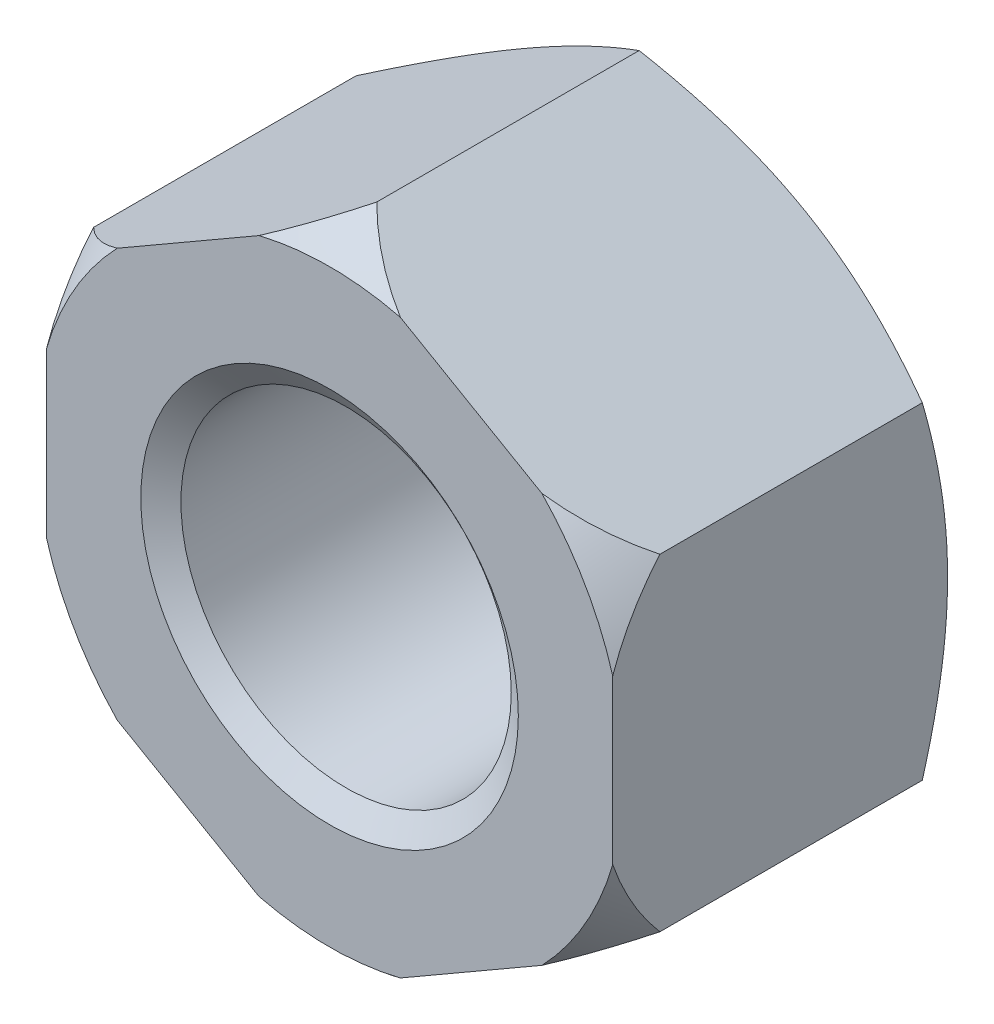
ISO-10303-21;
HEADER;
FILE_DESCRIPTION(('STEP AP214'),'2;1');
FILE_NAME('part.step','',(''),(''),'','','');
FILE_SCHEMA(('AUTOMOTIVE_DESIGN { 1 0 10303 214 1 1 1 1 }'));
ENDSEC;
DATA;
#1=APPLICATION_CONTEXT('core data for automotive mechanical design processes');
#2=APPLICATION_PROTOCOL_DEFINITION('international standard','automotive_design',2000,#1);
#3=PRODUCT_CONTEXT('',#1,'mechanical');
#4=PRODUCT('Part','Part','',(#3));
#5=PRODUCT_RELATED_PRODUCT_CATEGORY('part','',(#4));
#6=PRODUCT_DEFINITION_FORMATION('','',#4);
#7=PRODUCT_DEFINITION_CONTEXT('part definition',#1,'design');
#8=PRODUCT_DEFINITION('design','',#6,#7);
#9=PRODUCT_DEFINITION_SHAPE('','',#8);
#10=(LENGTH_UNIT() NAMED_UNIT(*) SI_UNIT(.MILLI.,.METRE.));
#11=(NAMED_UNIT(*) PLANE_ANGLE_UNIT() SI_UNIT($,.RADIAN.));
#12=(NAMED_UNIT(*) SI_UNIT($,.STERADIAN.) SOLID_ANGLE_UNIT());
#13=UNCERTAINTY_MEASURE_WITH_UNIT(LENGTH_MEASURE(1.E-05),#10,'distance_accuracy_value','');
#14=(GEOMETRIC_REPRESENTATION_CONTEXT(3) GLOBAL_UNCERTAINTY_ASSIGNED_CONTEXT((#13)) GLOBAL_UNIT_ASSIGNED_CONTEXT((#10,
#11,#12)) REPRESENTATION_CONTEXT('',''));
#15=CARTESIAN_POINT('',(0.,0.,0.));
#16=DIRECTION('',(0.,0.,1.));
#17=DIRECTION('',(1.,0.,0.));
#18=AXIS2_PLACEMENT_3D('',#15,#16,#17);
#19=CARTESIAN_POINT('',(0.,0.,-22.5298));
#20=DIRECTION('',(0.,0.,1.));
#21=DIRECTION('',(1.,0.,0.));
#22=AXIS2_PLACEMENT_3D('',#19,#20,#21);
#23=CYLINDRICAL_SURFACE('',#22,11.1125);
#24=CARTESIAN_POINT('',(0.,0.,-1.11157946690792));
#25=DIRECTION('',(0.,0.,1.));
#26=DIRECTION('',(1.,0.,0.));
#27=AXIS2_PLACEMENT_3D('',#24,#25,#26);
#28=CIRCLE('',#27,11.1125);
#29=CARTESIAN_POINT('',(11.1125,0.,-1.11157946690792));
#30=VERTEX_POINT('',#29);
#31=EDGE_CURVE('E149',#30,#30,#28,.F.);
#32=ORIENTED_EDGE('',*,*,#31,.F.);
#33=EDGE_LOOP('',(#32));
#34=FACE_BOUND('',#33,.T.);
#35=CARTESIAN_POINT('',(0.,0.,-21.3928205330921));
#36=DIRECTION('',(0.,0.,-1.));
#37=DIRECTION('',(-1.,0.,0.));
#38=AXIS2_PLACEMENT_3D('',#35,#36,#37);
#39=CIRCLE('',#38,11.1125);
#40=CARTESIAN_POINT('',(-11.1125,0.,-21.3928205330921));
#41=VERTEX_POINT('',#40);
#42=EDGE_CURVE('E37',#41,#41,#39,.F.);
#43=ORIENTED_EDGE('',*,*,#42,.F.);
#44=EDGE_LOOP('',(#43));
#45=FACE_BOUND('',#44,.T.);
#46=ADVANCED_FACE('F32',(#34,#45),#23,.F.);
#47=CARTESIAN_POINT('',(0.,21.9970452561248,0.));
#48=DIRECTION('',(0.,0.,-1.));
#49=DIRECTION('',(-1.,0.,0.));
#50=AXIS2_PLACEMENT_3D('',#47,#48,#49);
#51=PLANE('',#50);
#52=CARTESIAN_POINT('',(0.,0.,0.));
#53=DIRECTION('',(0.,0.,1.));
#54=DIRECTION('',(1.,0.,0.));
#55=AXIS2_PLACEMENT_3D('',#52,#53,#54);
#56=CIRCLE('',#55,12.7);
#57=CARTESIAN_POINT('',(12.7,0.,0.));
#58=VERTEX_POINT('',#57);
#59=EDGE_CURVE('E196',#58,#58,#56,.T.);
#60=ORIENTED_EDGE('',*,*,#59,.F.);
#61=EDGE_LOOP('',(#60));
#62=FACE_BOUND('',#61,.T.);
#63=DIRECTION('',(0.,-1.,0.));
#64=VECTOR('',#63,1.);
#65=CARTESIAN_POINT('',(-19.05,10.9985226280624,0.));
#66=LINE('',#65,#64);
#67=CARTESIAN_POINT('',(-19.05,5.49926131403105,0.));
#68=VERTEX_POINT('',#67);
#69=CARTESIAN_POINT('',(-19.05,-5.49926131403105,0.));
#70=VERTEX_POINT('',#69);
#71=EDGE_CURVE('E360',#68,#70,#66,.T.);
#72=ORIENTED_EDGE('',*,*,#71,.T.);
#73=CARTESIAN_POINT('',(0.,0.,0.));
#74=DIRECTION('',(0.,0.,-1.));
#75=DIRECTION('',(-1.,0.,0.));
#76=AXIS2_PLACEMENT_3D('',#73,#74,#75);
#77=CIRCLE('',#76,19.8278686449149);
#78=CARTESIAN_POINT('',(-14.2874999999999,-13.7481532850781,0.));
#79=VERTEX_POINT('',#78);
#80=EDGE_CURVE('E11',#70,#79,#77,.F.);
#81=ORIENTED_EDGE('',*,*,#80,.T.);
#82=DIRECTION('',(0.866025403784438,-0.5,0.));
#83=VECTOR('',#82,1.);
#84=CARTESIAN_POINT('',(-19.05,-10.9985226280624,0.));
#85=LINE('',#84,#83);
#86=CARTESIAN_POINT('',(-4.76250000000018,-19.2474145991091,0.));
#87=VERTEX_POINT('',#86);
#88=EDGE_CURVE('E169',#79,#87,#85,.T.);
#89=ORIENTED_EDGE('',*,*,#88,.T.);
#90=CARTESIAN_POINT('',(4.76250000000019,-19.2474145991091,0.));
#91=VERTEX_POINT('',#90);
#92=EDGE_CURVE('E42',#87,#91,#77,.F.);
#93=ORIENTED_EDGE('',*,*,#92,.T.);
#94=DIRECTION('',(0.866025403784439,0.5,0.));
#95=VECTOR('',#94,1.);
#96=CARTESIAN_POINT('',(0.,-21.9970452561248,0.));
#97=LINE('',#96,#95);
#98=CARTESIAN_POINT('',(14.2874999999998,-13.7481532850781,0.));
#99=VERTEX_POINT('',#98);
#100=EDGE_CURVE('E165',#91,#99,#97,.T.);
#101=ORIENTED_EDGE('',*,*,#100,.T.);
#102=CARTESIAN_POINT('',(19.05,-5.49926131403103,0.));
#103=VERTEX_POINT('',#102);
#104=EDGE_CURVE('E163',#99,#103,#77,.F.);
#105=ORIENTED_EDGE('',*,*,#104,.T.);
#106=DIRECTION('',(0.,-1.,0.));
#107=VECTOR('',#106,1.);
#108=CARTESIAN_POINT('',(19.05,10.9985226280624,0.));
#109=LINE('',#108,#107);
#110=CARTESIAN_POINT('',(19.05,5.49926131403103,0.));
#111=VERTEX_POINT('',#110);
#112=EDGE_CURVE('E155',#111,#103,#109,.T.);
#113=ORIENTED_EDGE('',*,*,#112,.F.);
#114=CARTESIAN_POINT('',(0.,0.,0.));
#115=DIRECTION('',(0.,0.,1.));
#116=DIRECTION('',(1.,0.,0.));
#117=AXIS2_PLACEMENT_3D('',#114,#115,#116);
#118=CIRCLE('',#117,19.8278686449149);
#119=CARTESIAN_POINT('',(14.2874999999999,13.748153285078,0.));
#120=VERTEX_POINT('',#119);
#121=EDGE_CURVE('E140',#111,#120,#118,.T.);
#122=ORIENTED_EDGE('',*,*,#121,.T.);
#123=DIRECTION('',(-0.866025403784438,0.500000000000001,0.));
#124=VECTOR('',#123,1.);
#125=CARTESIAN_POINT('',(19.05,10.9985226280624,0.));
#126=LINE('',#125,#124);
#127=CARTESIAN_POINT('',(4.76250000000015,19.2474145991091,0.));
#128=VERTEX_POINT('',#127);
#129=EDGE_CURVE('E164',#120,#128,#126,.T.);
#130=ORIENTED_EDGE('',*,*,#129,.T.);
#131=CARTESIAN_POINT('',(-4.76250000000013,19.2474145991091,0.));
#132=VERTEX_POINT('',#131);
#133=EDGE_CURVE('E194',#128,#132,#77,.F.);
#134=ORIENTED_EDGE('',*,*,#133,.T.);
#135=DIRECTION('',(-0.866025403784438,-0.5,0.));
#136=VECTOR('',#135,1.);
#137=CARTESIAN_POINT('',(0.,21.9970452561248,0.));
#138=LINE('',#137,#136);
#139=CARTESIAN_POINT('',(-14.2874999999999,13.748153285078,0.));
#140=VERTEX_POINT('',#139);
#141=EDGE_CURVE('E284',#132,#140,#138,.T.);
#142=ORIENTED_EDGE('',*,*,#141,.T.);
#143=EDGE_CURVE('E44',#140,#68,#77,.F.);
#144=ORIENTED_EDGE('',*,*,#143,.T.);
#145=EDGE_LOOP('',(#72,#81,#89,#93,#101,#105,#113,#122,#130,#134,#142,#144));
#146=FACE_BOUND('',#145,.T.);
#147=ADVANCED_FACE('F161',(#62,#146),#51,.F.);
#148=CARTESIAN_POINT('',(0.,21.9970452561248,-22.5298));
#149=DIRECTION('',(0.,0.,-1.));
#150=DIRECTION('',(-1.,0.,0.));
#151=AXIS2_PLACEMENT_3D('',#148,#149,#150);
#152=PLANE('',#151);
#153=CARTESIAN_POINT('',(0.,0.,-22.5298));
#154=DIRECTION('',(0.,0.,-1.));
#155=DIRECTION('',(-1.,0.,0.));
#156=AXIS2_PLACEMENT_3D('',#153,#154,#155);
#157=CIRCLE('',#156,12.7);
#158=CARTESIAN_POINT('',(-12.7,0.,-22.5298));
#159=VERTEX_POINT('',#158);
#160=EDGE_CURVE('E197',#159,#159,#157,.F.);
#161=ORIENTED_EDGE('',*,*,#160,.T.);
#162=EDGE_LOOP('',(#161));
#163=FACE_BOUND('',#162,.T.);
#164=CARTESIAN_POINT('',(0.,0.,-22.5298));
#165=DIRECTION('',(0.,0.,-1.));
#166=DIRECTION('',(-1.,0.,0.));
#167=AXIS2_PLACEMENT_3D('',#164,#165,#166);
#168=CIRCLE('',#167,19.05);
#169=CARTESIAN_POINT('',(-19.05,0.,-22.5298));
#170=VERTEX_POINT('',#169);
#171=CARTESIAN_POINT('',(-9.52500000000001,-16.4977839420936,-22.5298));
#172=VERTEX_POINT('',#171);
#173=EDGE_CURVE('E191',#170,#172,#168,.F.);
#174=ORIENTED_EDGE('',*,*,#173,.F.);
#175=CARTESIAN_POINT('',(-9.52500000000001,16.4977839420936,-22.5298));
#176=VERTEX_POINT('',#175);
#177=EDGE_CURVE('E176',#176,#170,#168,.F.);
#178=ORIENTED_EDGE('',*,*,#177,.F.);
#179=CARTESIAN_POINT('',(9.52500000000002,16.4977839420936,-22.5298));
#180=VERTEX_POINT('',#179);
#181=EDGE_CURVE('E190',#180,#176,#168,.F.);
#182=ORIENTED_EDGE('',*,*,#181,.F.);
#183=CARTESIAN_POINT('',(0.,0.,-22.5298));
#184=DIRECTION('',(0.,0.,1.));
#185=DIRECTION('',(1.,0.,0.));
#186=AXIS2_PLACEMENT_3D('',#183,#184,#185);
#187=CIRCLE('',#186,19.05);
#188=CARTESIAN_POINT('',(19.05,0.,-22.5298));
#189=VERTEX_POINT('',#188);
#190=EDGE_CURVE('E223',#189,#180,#187,.T.);
#191=ORIENTED_EDGE('',*,*,#190,.F.);
#192=CARTESIAN_POINT('',(9.525,-16.4977839420936,-22.5298));
#193=VERTEX_POINT('',#192);
#194=EDGE_CURVE('E378',#193,#189,#168,.F.);
#195=ORIENTED_EDGE('',*,*,#194,.F.);
#196=EDGE_CURVE('E376',#172,#193,#168,.F.);
#197=ORIENTED_EDGE('',*,*,#196,.F.);
#198=EDGE_LOOP('',(#174,#178,#182,#191,#195,#197));
#199=FACE_BOUND('',#198,.T.);
#200=ADVANCED_FACE('F312',(#163,#199),#152,.T.);
#201=CARTESIAN_POINT('',(0.,21.9970452561248,-22.5298));
#202=DIRECTION('',(-0.5,0.866025403784438,0.));
#203=DIRECTION('',(-0.866025403784439,-0.5,0.));
#204=AXIS2_PLACEMENT_3D('',#201,#202,#203);
#205=PLANE('',#204);
#206=CARTESIAN_POINT('',(-9.52500000000001,16.4977839420936,-15.875));
#207=DIRECTION('',(-0.5,0.866025403784438,0.));
#208=DIRECTION('',(-0.866025403784439,-0.5,0.));
#209=AXIS2_PLACEMENT_3D('',#206,#207,#208);
#210=CIRCLE('',#209,16.8005208252601);
#211=CARTESIAN_POINT('',(0.,21.9970452561248,-3.17500000000008));
#212=VERTEX_POINT('',#211);
#213=EDGE_CURVE('E214',#212,#132,#210,.F.);
#214=ORIENTED_EDGE('',*,*,#213,.F.);
#215=DIRECTION('',(0.,0.,1.));
#216=VECTOR('',#215,1.);
#217=CARTESIAN_POINT('',(0.,21.9970452561248,-22.5298));
#218=LINE('',#217,#216);
#219=CARTESIAN_POINT('',(0.,21.9970452561248,-20.8283226280624));
#220=VERTEX_POINT('',#219);
#221=EDGE_CURVE('E173',#220,#212,#218,.T.);
#222=ORIENTED_EDGE('',*,*,#221,.F.);
#223=CARTESIAN_POINT('',(-19.0502,10.9984071580085,-20.8282559608708));
#224=CARTESIAN_POINT('',(-18.6314889424188,11.2401500998157,-20.9678165828918));
#225=CARTESIAN_POINT('',(-18.2111446870423,11.4828359688097,-21.1010441544707));
#226=CARTESIAN_POINT('',(-17.3670855155916,11.9701537586587,-21.3530728349218));
#227=CARTESIAN_POINT('',(-16.9433695394589,12.2147862915388,-21.4718691989687));
#228=CARTESIAN_POINT('',(-16.0917480208183,12.7064702045736,-21.6934385965292));
#229=CARTESIAN_POINT('',(-15.6638350258304,12.9535258874197,-21.7961737172867));
#230=CARTESIAN_POINT('',(-14.8050356703556,13.4493539264829,-21.9834145659122));
#231=CARTESIAN_POINT('',(-14.374149481613,13.6981261835436,-22.0679213377796));
#232=CARTESIAN_POINT('',(-13.5204444881885,14.1910129913057,-22.2151111722824));
#233=CARTESIAN_POINT('',(-13.0976890621094,14.4350909503539,-22.2782814079947));
#234=CARTESIAN_POINT('',(-12.250241089937,14.9243652652118,-22.3842036549849));
#235=CARTESIAN_POINT('',(-11.8255485067156,15.1695616424575,-22.4269552732395));
#236=CARTESIAN_POINT('',(-10.9754499399404,15.6603662788229,-22.4909608321001));
#237=CARTESIAN_POINT('',(-10.5500454086646,15.9059736994695,-22.5122403182784));
#238=CARTESIAN_POINT('',(-9.69884369005559,16.397415240843,-22.532843984881));
#239=CARTESIAN_POINT('',(-9.27304651526212,16.6432493543302,-22.5321688437294));
#240=CARTESIAN_POINT('',(-8.47700964232624,17.1028414572046,-22.5103966011497));
#241=CARTESIAN_POINT('',(-8.10671322507251,17.316632193386,-22.4919544300647));
#242=CARTESIAN_POINT('',(-7.3670036910329,17.7437036919859,-22.4388155695897));
#243=CARTESIAN_POINT('',(-6.99759056167258,17.9569844616643,-22.404119112996));
#244=CARTESIAN_POINT('',(-6.25978756382387,18.3829552210812,-22.3190737251097));
#245=CARTESIAN_POINT('',(-5.89139892582436,18.5956445003966,-22.2687106394333));
#246=CARTESIAN_POINT('',(-5.1563753345796,19.0200105686625,-22.1532206991707));
#247=CARTESIAN_POINT('',(-4.7897403739103,19.2316873618992,-22.0880939071419));
#248=CARTESIAN_POINT('',(-3.67677271593589,19.8742595388301,-21.8689116004567));
#249=CARTESIAN_POINT('',(-2.93366305060603,20.3032941041457,-21.6930008306796));
#250=CARTESIAN_POINT('',(-1.45852420538159,21.1549659135281,-21.2937556590568));
#251=CARTESIAN_POINT('',(-0.726476139694536,21.5776140613123,-21.0705150174847));
#252=CARTESIAN_POINT('',(0.000200000000004846,21.9971607261786,-20.8282559608708));
#253=B_SPLINE_CURVE_WITH_KNOTS('',3,(#223,#224,#225,#226,#227,#228,#229,#230,#231,#232,#233,
#234,#235,#236,#237,#238,#239,#240,#241,#242,#243,#244,#245,#246,#247,#248,#249,#250,#251,#252),
.UNSPECIFIED.,.F.,.F.,(4,2,2,2,2,2,2,2,2,2,2,2,2,2,4),(0.,1.50971559281794,3.01992622800797,
4.53364959201314,6.04728623691164,7.52356313869614,8.99986845512144,10.4744153207586,
11.9489166211862,13.2325441548787,14.5161533048254,15.8009255464228,17.085692344219,
19.7118183650732,22.3327898553892),.UNSPECIFIED.);
#254=EDGE_CURVE('E276',#176,#220,#253,.T.);
#255=ORIENTED_EDGE('',*,*,#254,.F.);
#256=CARTESIAN_POINT('',(-19.05,10.9985226280624,-20.8283226280624));
#257=VERTEX_POINT('',#256);
#258=EDGE_CURVE('E270',#257,#176,#253,.T.);
#259=ORIENTED_EDGE('',*,*,#258,.F.);
#260=DIRECTION('',(0.,0.,1.));
#261=VECTOR('',#260,1.);
#262=CARTESIAN_POINT('',(-19.05,10.9985226280624,-22.5298));
#263=LINE('',#262,#261);
#264=CARTESIAN_POINT('',(-19.05,10.9985226280624,-3.17500000000008));
#265=VERTEX_POINT('',#264);
#266=EDGE_CURVE('E167',#257,#265,#263,.T.);
#267=ORIENTED_EDGE('',*,*,#266,.T.);
#268=EDGE_CURVE('E211',#140,#265,#210,.F.);
#269=ORIENTED_EDGE('',*,*,#268,.F.);
#270=ORIENTED_EDGE('',*,*,#141,.F.);
#271=EDGE_LOOP('',(#214,#222,#255,#259,#267,#269,#270));
#272=FACE_BOUND('',#271,.T.);
#273=ADVANCED_FACE('F34',(#272),#205,.T.);
#274=CARTESIAN_POINT('',(19.05,10.9985226280624,-22.5298));
#275=DIRECTION('',(0.500000000000001,0.866025403784438,0.));
#276=DIRECTION('',(-0.866025403784438,0.500000000000001,0.));
#277=AXIS2_PLACEMENT_3D('',#274,#275,#276);
#278=PLANE('',#277);
#279=CARTESIAN_POINT('',(9.52500000000002,16.4977839420936,-15.875));
#280=DIRECTION('',(0.500000000000001,0.866025403784438,0.));
#281=DIRECTION('',(-0.866025403784438,0.500000000000001,0.));
#282=AXIS2_PLACEMENT_3D('',#279,#280,#281);
#283=CIRCLE('',#282,16.8005208252601);
#284=CARTESIAN_POINT('',(19.05,10.9985226280624,-3.17500000000008));
#285=VERTEX_POINT('',#284);
#286=EDGE_CURVE('E51',#285,#120,#283,.F.);
#287=ORIENTED_EDGE('',*,*,#286,.F.);
#288=DIRECTION('',(0.,0.,1.));
#289=VECTOR('',#288,1.);
#290=CARTESIAN_POINT('',(19.05,10.9985226280624,-22.5298));
#291=LINE('',#290,#289);
#292=CARTESIAN_POINT('',(19.05,10.9985226280624,-20.8283226280624));
#293=VERTEX_POINT('',#292);
#294=EDGE_CURVE('E158',#293,#285,#291,.T.);
#295=ORIENTED_EDGE('',*,*,#294,.F.);
#296=CARTESIAN_POINT('',(-0.000199999999995582,21.9971607261786,-20.8282559608708));
#297=CARTESIAN_POINT('',(0.418511057581229,21.7554177843714,-20.9678165828918));
#298=CARTESIAN_POINT('',(0.838855312957746,21.5127319153775,-21.1010441544707));
#299=CARTESIAN_POINT('',(1.68291448440843,21.0254141255284,-21.3530728349218));
#300=CARTESIAN_POINT('',(2.10663046054108,20.7807815926483,-21.4718691989687));
#301=CARTESIAN_POINT('',(2.95825197918166,20.2890976796135,-21.6934385965292));
#302=CARTESIAN_POINT('',(3.38616497416957,20.0420419967675,-21.7961737172867));
#303=CARTESIAN_POINT('',(4.24496432964445,19.5462139577042,-21.9834145659122));
#304=CARTESIAN_POINT('',(4.67585051838703,19.2974417006435,-22.0679213377796));
#305=CARTESIAN_POINT('',(5.52955551181152,18.8045548928814,-22.2151111722824));
#306=CARTESIAN_POINT('',(5.95231093789063,18.5604769338332,-22.2782814079947));
#307=CARTESIAN_POINT('',(6.799758910063,18.0712026189753,-22.3842036549849));
#308=CARTESIAN_POINT('',(7.22445149328436,17.8260062417296,-22.4269552732395));
#309=CARTESIAN_POINT('',(8.07455006005965,17.3352016053642,-22.4909608321001));
#310=CARTESIAN_POINT('',(8.49995459133543,17.0895941847176,-22.5122403182784));
#311=CARTESIAN_POINT('',(9.35115630994441,16.5981526433441,-22.532843984881));
#312=CARTESIAN_POINT('',(9.77695348473788,16.3523185298569,-22.5321688437294));
#313=CARTESIAN_POINT('',(10.5729903576738,15.8927264269825,-22.5103966011497));
#314=CARTESIAN_POINT('',(10.9432867749275,15.6789356908011,-22.4919544300647));
#315=CARTESIAN_POINT('',(11.6829963089671,15.2518641922012,-22.4388155695897));
#316=CARTESIAN_POINT('',(12.0524094383274,15.0385834225228,-22.4041191129961));
#317=CARTESIAN_POINT('',(12.7902124361761,14.612612663106,-22.3190737251097));
#318=CARTESIAN_POINT('',(13.1586010741756,14.3999233837905,-22.2687106394333));
#319=CARTESIAN_POINT('',(13.8936246654204,13.9755573155246,-22.1532206991707));
#320=CARTESIAN_POINT('',(14.2602596260897,13.7638805222879,-22.0880939071419));
#321=CARTESIAN_POINT('',(15.3732272840641,13.121308345357,-21.8689116004567));
#322=CARTESIAN_POINT('',(16.116336949394,12.6922737800414,-21.6930008306796));
#323=CARTESIAN_POINT('',(17.5914757946184,11.840601970659,-21.2937556590568));
#324=CARTESIAN_POINT('',(18.3235238603055,11.4179538228748,-21.0705150174847));
#325=CARTESIAN_POINT('',(19.0502,10.9984071580085,-20.8282559608708));
#326=B_SPLINE_CURVE_WITH_KNOTS('',3,(#296,#297,#298,#299,#300,#301,#302,#303,#304,#305,#306,
#307,#308,#309,#310,#311,#312,#313,#314,#315,#316,#317,#318,#319,#320,#321,#322,#323,#324,#325),
.UNSPECIFIED.,.F.,.F.,(4,2,2,2,2,2,2,2,2,2,2,2,2,2,4),(0.,1.50971559281794,3.01992622800797,
4.53364959201314,6.04728623691165,7.52356313869614,8.99986845512144,10.4744153207586,
11.9489166211862,13.2325441548787,14.5161533048254,15.8009255464228,17.085692344219,
19.7118183650732,22.3327898553892),.UNSPECIFIED.);
#327=EDGE_CURVE('E277',#180,#293,#326,.T.);
#328=ORIENTED_EDGE('',*,*,#327,.F.);
#329=EDGE_CURVE('E283',#220,#180,#326,.T.);
#330=ORIENTED_EDGE('',*,*,#329,.F.);
#331=ORIENTED_EDGE('',*,*,#221,.T.);
#332=EDGE_CURVE('E222',#128,#212,#283,.F.);
#333=ORIENTED_EDGE('',*,*,#332,.F.);
#334=ORIENTED_EDGE('',*,*,#129,.F.);
#335=EDGE_LOOP('',(#287,#295,#328,#330,#331,#333,#334));
#336=FACE_BOUND('',#335,.T.);
#337=ADVANCED_FACE('F286',(#336),#278,.T.);
#338=CARTESIAN_POINT('',(19.05,10.9985226280624,-22.5298));
#339=DIRECTION('',(-1.,0.,0.));
#340=DIRECTION('',(0.,0.,1.));
#341=AXIS2_PLACEMENT_3D('',#338,#339,#340);
#342=PLANE('',#341);
#343=ORIENTED_EDGE('',*,*,#112,.T.);
#344=CARTESIAN_POINT('',(19.05,0.,-15.875));
#345=DIRECTION('',(-1.,0.,0.));
#346=DIRECTION('',(0.,0.,1.));
#347=AXIS2_PLACEMENT_3D('',#344,#345,#346);
#348=CIRCLE('',#347,16.8005208252601);
#349=CARTESIAN_POINT('',(19.05,-10.9985226280624,-3.17500000000008));
#350=VERTEX_POINT('',#349);
#351=EDGE_CURVE('E59',#103,#350,#348,.F.);
#352=ORIENTED_EDGE('',*,*,#351,.T.);
#353=DIRECTION('',(0.,0.,1.));
#354=VECTOR('',#353,1.);
#355=CARTESIAN_POINT('',(19.05,-10.9985226280624,-22.5298));
#356=LINE('',#355,#354);
#357=CARTESIAN_POINT('',(19.05,-10.9985226280624,-20.8283226280624));
#358=VERTEX_POINT('',#357);
#359=EDGE_CURVE('E178',#358,#350,#356,.T.);
#360=ORIENTED_EDGE('',*,*,#359,.F.);
#361=CARTESIAN_POINT('',(19.05,-29.169702852179,-13.4138662638416));
#362=CARTESIAN_POINT('',(19.05,-28.7515170158437,-13.6160110956725));
#363=CARTESIAN_POINT('',(19.05,-28.3328257173085,-13.8171097388201));
#364=CARTESIAN_POINT('',(19.05,-27.494325409167,-14.2169745091899));
#365=CARTESIAN_POINT('',(19.05,-27.0745163873414,-14.4157406107826));
#366=CARTESIAN_POINT('',(19.05,-25.813129635616,-15.0082374735336));
#367=CARTESIAN_POINT('',(19.05,-24.9697281338906,-15.3981009037459));
#368=CARTESIAN_POINT('',(19.05,-23.2722707252134,-16.1672287767744));
#369=CARTESIAN_POINT('',(19.05,-22.4181814672043,-16.546419798557));
#370=CARTESIAN_POINT('',(19.05,-20.7029839633497,-17.2885211662357));
#371=CARTESIAN_POINT('',(19.05,-19.8418760858487,-17.6514323600953));
#372=CARTESIAN_POINT('',(19.05,-18.1005821949281,-18.3609430110762));
#373=CARTESIAN_POINT('',(19.05,-17.2202917493445,-18.7072875110348));
#374=CARTESIAN_POINT('',(19.05,-15.4493217028707,-19.3728520719423));
#375=CARTESIAN_POINT('',(19.05,-14.5586409597487,-19.6920691181272));
#376=CARTESIAN_POINT('',(19.05,-12.7673320093036,-20.2947971916329));
#377=CARTESIAN_POINT('',(19.05,-11.8667295562314,-20.5783841335592));
#378=CARTESIAN_POINT('',(19.05,-10.0526343476905,-21.1006560776936));
#379=CARTESIAN_POINT('',(19.05,-9.13914576283874,-21.3393552650209));
#380=CARTESIAN_POINT('',(19.05,-7.75907469613669,-21.6550001353604));
#381=CARTESIAN_POINT('',(19.05,-7.29731333096125,-21.7531639276993));
#382=CARTESIAN_POINT('',(19.05,-6.37071732035876,-21.9338068057719));
#383=CARTESIAN_POINT('',(19.05,-5.90588274419356,-22.0162862437501));
#384=CARTESIAN_POINT('',(19.05,-4.97345228347655,-22.164098170237));
#385=CARTESIAN_POINT('',(19.05,-4.50585623113595,-22.2294296056319));
#386=CARTESIAN_POINT('',(19.05,-3.56843861997923,-22.3416333265324));
#387=CARTESIAN_POINT('',(19.05,-3.09861705851874,-22.388505590099));
#388=CARTESIAN_POINT('',(19.05,-2.16041609237781,-22.4625291100109));
#389=CARTESIAN_POINT('',(19.05,-1.6920464874522,-22.4898037599781));
#390=CARTESIAN_POINT('',(19.05,-0.754574655686925,-22.5244886648534));
#391=CARTESIAN_POINT('',(19.05,-0.285472440023931,-22.5318992199015));
#392=CARTESIAN_POINT('',(19.05,0.652492903955211,-22.5266801819297));
#393=CARTESIAN_POINT('',(19.05,1.1213560625119,-22.5140561325829));
#394=CARTESIAN_POINT('',(19.05,2.05813737693966,-22.4690817861607));
#395=CARTESIAN_POINT('',(19.05,2.52605549030136,-22.4367306207241));
#396=CARTESIAN_POINT('',(19.05,3.65980250445306,-22.3351199015635));
#397=CARTESIAN_POINT('',(19.05,4.32476458495627,-22.2559962800964));
#398=CARTESIAN_POINT('',(19.05,5.64947952989346,-22.0623146371856));
#399=CARTESIAN_POINT('',(19.05,6.30923160661033,-21.9477513588539));
#400=CARTESIAN_POINT('',(19.05,8.2818238219053,-21.556648180003));
#401=CARTESIAN_POINT('',(19.05,9.58542312013704,-21.2329552971933));
#402=CARTESIAN_POINT('',(19.05,11.5353898831337,-20.6748015455895));
#403=CARTESIAN_POINT('',(19.05,12.191945455476,-20.4739165985094));
#404=CARTESIAN_POINT('',(19.05,13.498713616712,-20.0521176359409));
#405=CARTESIAN_POINT('',(19.05,14.1489256271383,-19.8312018124068));
#406=CARTESIAN_POINT('',(19.05,15.439765608065,-19.3740482582399));
#407=CARTESIAN_POINT('',(19.05,16.0804269482461,-19.1379039599531));
#408=CARTESIAN_POINT('',(19.05,17.0373840365627,-18.7734634596579));
#409=CARTESIAN_POINT('',(19.05,17.3556458209396,-18.650300142409));
#410=CARTESIAN_POINT('',(19.05,17.9909330309769,-18.4008420821487));
#411=CARTESIAN_POINT('',(19.05,18.3079584810038,-18.2745474012171));
#412=CARTESIAN_POINT('',(19.05,18.6244086642405,-18.1468283563449));
#413=B_SPLINE_CURVE_WITH_KNOTS('',3,(#361,#362,#363,#364,#365,#366,#367,#368,#369,#370,#371,
#372,#373,#374,#375,#376,#377,#378,#379,#380,#381,#382,#383,#384,#385,#386,#387,#388,#389,#390,
#391,#392,#393,#394,#395,#396,#397,#398,#399,#400,#401,#402,#403,#404,#405,#406,#407,#408,#409,
#410,#411,#412),.UNSPECIFIED.,.F.,.F.,(4,2,2,2,2,2,2,2,2,2,2,2,2,2,2,2,2,2,2,2,2,2,2,2,2,4),(0.,
1.39343811466813,2.78689152584544,5.57425145066782,8.37756231436865,11.1807269927528,
14.0183059326613,16.856199810853,19.6879407755784,22.5187853636699,23.934802353684,
25.3507875385607,26.766859663288,28.1829334710278,29.5900111205978,30.9970675095625,
32.4037346270206,33.8104636685473,35.8182820070619,37.8263983152062,41.8503661996048,
43.910005496493,45.9698308879145,48.018040072954,49.0418117683235,50.0655631834717),.UNSPECIFIED.);
#414=EDGE_CURVE('E264',#358,#189,#413,.T.);
#415=ORIENTED_EDGE('',*,*,#414,.T.);
#416=EDGE_CURVE('E275',#189,#293,#413,.T.);
#417=ORIENTED_EDGE('',*,*,#416,.T.);
#418=ORIENTED_EDGE('',*,*,#294,.T.);
#419=EDGE_CURVE('E143',#285,#111,#348,.F.);
#420=ORIENTED_EDGE('',*,*,#419,.T.);
#421=EDGE_LOOP('',(#343,#352,#360,#415,#417,#418,#420));
#422=FACE_BOUND('',#421,.T.);
#423=ADVANCED_FACE('F154',(#422),#342,.F.);
#424=CARTESIAN_POINT('',(0.,-21.9970452561248,-22.5298));
#425=DIRECTION('',(0.5,-0.866025403784439,0.));
#426=DIRECTION('',(0.866025403784439,0.5,0.));
#427=AXIS2_PLACEMENT_3D('',#424,#425,#426);
#428=PLANE('',#427);
#429=CARTESIAN_POINT('',(9.52500000000001,-16.4977839420936,-15.875));
#430=DIRECTION('',(0.5,-0.866025403784439,0.));
#431=DIRECTION('',(0.866025403784439,0.5,0.));
#432=AXIS2_PLACEMENT_3D('',#429,#430,#431);
#433=CIRCLE('',#432,16.8005208252601);
#434=CARTESIAN_POINT('',(0.,-21.9970452561248,-3.17500000000008));
#435=VERTEX_POINT('',#434);
#436=EDGE_CURVE('E218',#435,#91,#433,.F.);
#437=ORIENTED_EDGE('',*,*,#436,.F.);
#438=DIRECTION('',(0.,0.,1.));
#439=VECTOR('',#438,1.);
#440=CARTESIAN_POINT('',(0.,-21.9970452561248,-22.5298));
#441=LINE('',#440,#439);
#442=CARTESIAN_POINT('',(0.,-21.9970452561248,-20.8283226280624));
#443=VERTEX_POINT('',#442);
#444=EDGE_CURVE('E181',#443,#435,#441,.T.);
#445=ORIENTED_EDGE('',*,*,#444,.F.);
#446=CARTESIAN_POINT('',(19.0502,-10.9984071580086,-20.8282559608708));
#447=CARTESIAN_POINT('',(18.6314889424188,-11.2401500998157,-20.9678165828918));
#448=CARTESIAN_POINT('',(18.2111446870423,-11.4828359688097,-21.1010441544707));
#449=CARTESIAN_POINT('',(17.3670855155916,-11.9701537586587,-21.3530728349218));
#450=CARTESIAN_POINT('',(16.9433695394589,-12.2147862915388,-21.4718691989687));
#451=CARTESIAN_POINT('',(16.0917480208183,-12.7064702045737,-21.6934385965292));
#452=CARTESIAN_POINT('',(15.6638350258304,-12.9535258874197,-21.7961737172867));
#453=CARTESIAN_POINT('',(14.8050356703556,-13.449353926483,-21.9834145659122));
#454=CARTESIAN_POINT('',(14.374149481613,-13.6981261835436,-22.0679213377796));
#455=CARTESIAN_POINT('',(13.5204444881885,-14.1910129913057,-22.2151111722823));
#456=CARTESIAN_POINT('',(13.0976890621094,-14.4350909503539,-22.2782814079947));
#457=CARTESIAN_POINT('',(12.250241089937,-14.9243652652118,-22.3842036549849));
#458=CARTESIAN_POINT('',(11.8255485067156,-15.1695616424575,-22.4269552732395));
#459=CARTESIAN_POINT('',(10.9754499399404,-15.6603662788229,-22.4909608321001));
#460=CARTESIAN_POINT('',(10.5500454086646,-15.9059736994695,-22.5122403182784));
#461=CARTESIAN_POINT('',(9.69884369005559,-16.3974152408431,-22.532843984881));
#462=CARTESIAN_POINT('',(9.27304651526212,-16.6432493543303,-22.5321688437294));
#463=CARTESIAN_POINT('',(8.47700964232623,-17.1028414572047,-22.5103966011497));
#464=CARTESIAN_POINT('',(8.10671322507251,-17.3166321933861,-22.4919544300647));
#465=CARTESIAN_POINT('',(7.36700369103289,-17.743703691986,-22.4388155695897));
#466=CARTESIAN_POINT('',(6.99759056167258,-17.9569844616643,-22.404119112996));
#467=CARTESIAN_POINT('',(6.25978756382387,-18.3829552210812,-22.3190737251097));
#468=CARTESIAN_POINT('',(5.89139892582436,-18.5956445003966,-22.2687106394333));
#469=CARTESIAN_POINT('',(5.1563753345796,-19.0200105686625,-22.1532206991706));
#470=CARTESIAN_POINT('',(4.7897403739103,-19.2316873618992,-22.0880939071419));
#471=CARTESIAN_POINT('',(3.67677271593589,-19.8742595388301,-21.8689116004567));
#472=CARTESIAN_POINT('',(2.93366305060603,-20.3032941041457,-21.6930008306795));
#473=CARTESIAN_POINT('',(1.45852420538159,-21.1549659135281,-21.2937556590568));
#474=CARTESIAN_POINT('',(0.72647613969454,-21.5776140613123,-21.0705150174847));
#475=CARTESIAN_POINT('',(-0.000199999999999882,-21.9971607261786,-20.8282559608708));
#476=B_SPLINE_CURVE_WITH_KNOTS('',3,(#446,#447,#448,#449,#450,#451,#452,#453,#454,#455,#456,
#457,#458,#459,#460,#461,#462,#463,#464,#465,#466,#467,#468,#469,#470,#471,#472,#473,#474,#475),
.UNSPECIFIED.,.F.,.F.,(4,2,2,2,2,2,2,2,2,2,2,2,2,2,4),(0.,1.50971559281795,3.01992622800797,
4.53364959201315,6.04728623691165,7.52356313869614,8.99986845512144,10.4744153207586,
11.9489166211862,13.2325441548787,14.5161533048254,15.8009255464228,17.085692344219,
19.7118183650731,22.3327898553892),.UNSPECIFIED.);
#477=EDGE_CURVE('E258',#193,#443,#476,.T.);
#478=ORIENTED_EDGE('',*,*,#477,.F.);
#479=EDGE_CURVE('E390',#358,#193,#476,.T.);
#480=ORIENTED_EDGE('',*,*,#479,.F.);
#481=ORIENTED_EDGE('',*,*,#359,.T.);
#482=EDGE_CURVE('E219',#99,#350,#433,.F.);
#483=ORIENTED_EDGE('',*,*,#482,.F.);
#484=ORIENTED_EDGE('',*,*,#100,.F.);
#485=EDGE_LOOP('',(#437,#445,#478,#480,#481,#483,#484));
#486=FACE_BOUND('',#485,.T.);
#487=ADVANCED_FACE('F293',(#486),#428,.T.);
#488=CARTESIAN_POINT('',(-19.05,-10.9985226280624,-22.5298));
#489=DIRECTION('',(-0.5,-0.866025403784438,0.));
#490=DIRECTION('',(0.866025403784438,-0.5,0.));
#491=AXIS2_PLACEMENT_3D('',#488,#489,#490);
#492=PLANE('',#491);
#493=CARTESIAN_POINT('',(-9.52500000000002,-16.4977839420936,-15.875));
#494=DIRECTION('',(-0.5,-0.866025403784438,0.));
#495=DIRECTION('',(0.866025403784438,-0.5,0.));
#496=AXIS2_PLACEMENT_3D('',#493,#494,#495);
#497=CIRCLE('',#496,16.8005208252601);
#498=CARTESIAN_POINT('',(-19.05,-10.9985226280624,-3.17500000000008));
#499=VERTEX_POINT('',#498);
#500=EDGE_CURVE('E215',#499,#79,#497,.F.);
#501=ORIENTED_EDGE('',*,*,#500,.F.);
#502=DIRECTION('',(0.,0.,1.));
#503=VECTOR('',#502,1.);
#504=CARTESIAN_POINT('',(-19.05,-10.9985226280624,-22.5298));
#505=LINE('',#504,#503);
#506=CARTESIAN_POINT('',(-19.05,-10.9985226280624,-20.8283226280624));
#507=VERTEX_POINT('',#506);
#508=EDGE_CURVE('E184',#507,#499,#505,.T.);
#509=ORIENTED_EDGE('',*,*,#508,.F.);
#510=CARTESIAN_POINT('',(0.00019999999999873,-21.9971607261786,-20.8282559608708));
#511=CARTESIAN_POINT('',(-0.418511057581227,-21.7554177843714,-20.9678165828917));
#512=CARTESIAN_POINT('',(-0.838855312957744,-21.5127319153775,-21.1010441544707));
#513=CARTESIAN_POINT('',(-1.68291448440843,-21.0254141255284,-21.3530728349218));
#514=CARTESIAN_POINT('',(-2.10663046054108,-20.7807815926483,-21.4718691989687));
#515=CARTESIAN_POINT('',(-2.95825197918166,-20.2890976796135,-21.6934385965292));
#516=CARTESIAN_POINT('',(-3.38616497416957,-20.0420419967675,-21.7961737172867));
#517=CARTESIAN_POINT('',(-4.24496432964445,-19.5462139577042,-21.9834145659122));
#518=CARTESIAN_POINT('',(-4.67585051838704,-19.2974417006436,-22.0679213377796));
#519=CARTESIAN_POINT('',(-5.52955551181152,-18.8045548928814,-22.2151111722823));
#520=CARTESIAN_POINT('',(-5.95231093789063,-18.5604769338333,-22.2782814079947));
#521=CARTESIAN_POINT('',(-6.799758910063,-18.0712026189753,-22.3842036549849));
#522=CARTESIAN_POINT('',(-7.22445149328436,-17.8260062417296,-22.4269552732395));
#523=CARTESIAN_POINT('',(-8.07455006005965,-17.3352016053642,-22.4909608321001));
#524=CARTESIAN_POINT('',(-8.49995459133543,-17.0895941847177,-22.5122403182784));
#525=CARTESIAN_POINT('',(-9.35115630994442,-16.5981526433441,-22.532843984881));
#526=CARTESIAN_POINT('',(-9.77695348473789,-16.3523185298569,-22.5321688437294));
#527=CARTESIAN_POINT('',(-10.5729903576738,-15.8927264269825,-22.5103966011497));
#528=CARTESIAN_POINT('',(-10.9432867749275,-15.6789356908011,-22.4919544300647));
#529=CARTESIAN_POINT('',(-11.6829963089671,-15.2518641922012,-22.4388155695897));
#530=CARTESIAN_POINT('',(-12.0524094383274,-15.0385834225228,-22.404119112996));
#531=CARTESIAN_POINT('',(-12.7902124361761,-14.612612663106,-22.3190737251097));
#532=CARTESIAN_POINT('',(-13.1586010741756,-14.3999233837906,-22.2687106394333));
#533=CARTESIAN_POINT('',(-13.8936246654204,-13.9755573155247,-22.1532206991707));
#534=CARTESIAN_POINT('',(-14.2602596260897,-13.7638805222879,-22.0880939071419));
#535=CARTESIAN_POINT('',(-15.3732272840641,-13.121308345357,-21.8689116004567));
#536=CARTESIAN_POINT('',(-16.116336949394,-12.6922737800414,-21.6930008306796));
#537=CARTESIAN_POINT('',(-17.5914757946184,-11.840601970659,-21.2937556590568));
#538=CARTESIAN_POINT('',(-18.3235238603055,-11.4179538228749,-21.0705150174847));
#539=CARTESIAN_POINT('',(-19.0502,-10.9984071580085,-20.8282559608708));
#540=B_SPLINE_CURVE_WITH_KNOTS('',3,(#510,#511,#512,#513,#514,#515,#516,#517,#518,#519,#520,
#521,#522,#523,#524,#525,#526,#527,#528,#529,#530,#531,#532,#533,#534,#535,#536,#537,#538,#539),
.UNSPECIFIED.,.F.,.F.,(4,2,2,2,2,2,2,2,2,2,2,2,2,2,4),(0.,1.50971559281795,3.01992622800797,
4.53364959201315,6.04728623691165,7.52356313869615,8.99986845512145,10.4744153207586,
11.9489166211862,13.2325441548787,14.5161533048254,15.8009255464228,17.085692344219,
19.7118183650731,22.3327898553892),.UNSPECIFIED.);
#541=EDGE_CURVE('E233',#172,#507,#540,.T.);
#542=ORIENTED_EDGE('',*,*,#541,.F.);
#543=EDGE_CURVE('E391',#443,#172,#540,.T.);
#544=ORIENTED_EDGE('',*,*,#543,.F.);
#545=ORIENTED_EDGE('',*,*,#444,.T.);
#546=EDGE_CURVE('E217',#87,#435,#497,.F.);
#547=ORIENTED_EDGE('',*,*,#546,.F.);
#548=ORIENTED_EDGE('',*,*,#88,.F.);
#549=EDGE_LOOP('',(#501,#509,#542,#544,#545,#547,#548));
#550=FACE_BOUND('',#549,.T.);
#551=ADVANCED_FACE('F296',(#550),#492,.T.);
#552=CARTESIAN_POINT('',(-19.05,10.9985226280624,-22.5298));
#553=DIRECTION('',(-1.,0.,0.));
#554=DIRECTION('',(0.,0.,1.));
#555=AXIS2_PLACEMENT_3D('',#552,#553,#554);
#556=PLANE('',#555);
#557=CARTESIAN_POINT('',(-19.05,0.,-15.875));
#558=DIRECTION('',(-1.,0.,0.));
#559=DIRECTION('',(0.,0.,1.));
#560=AXIS2_PLACEMENT_3D('',#557,#558,#559);
#561=CIRCLE('',#560,16.8005208252601);
#562=EDGE_CURVE('E212',#70,#499,#561,.F.);
#563=ORIENTED_EDGE('',*,*,#562,.F.);
#564=ORIENTED_EDGE('',*,*,#71,.F.);
#565=EDGE_CURVE('E148',#265,#68,#561,.F.);
#566=ORIENTED_EDGE('',*,*,#565,.F.);
#567=ORIENTED_EDGE('',*,*,#266,.F.);
#568=CARTESIAN_POINT('',(-19.05,-29.169702852179,-13.4138662638416));
#569=CARTESIAN_POINT('',(-19.05,-28.7515170158437,-13.6160110956725));
#570=CARTESIAN_POINT('',(-19.05,-28.3328257173085,-13.8171097388201));
#571=CARTESIAN_POINT('',(-19.05,-27.494325409167,-14.2169745091899));
#572=CARTESIAN_POINT('',(-19.05,-27.0745163873414,-14.4157406107827));
#573=CARTESIAN_POINT('',(-19.05,-25.8131296356159,-15.0082374735336));
#574=CARTESIAN_POINT('',(-19.05,-24.9697281338906,-15.3981009037459));
#575=CARTESIAN_POINT('',(-19.05,-23.2722707252134,-16.1672287767744));
#576=CARTESIAN_POINT('',(-19.05,-22.4181814672043,-16.546419798557));
#577=CARTESIAN_POINT('',(-19.05,-20.7029839633497,-17.2885211662357));
#578=CARTESIAN_POINT('',(-19.05,-19.8418760858486,-17.6514323600954));
#579=CARTESIAN_POINT('',(-19.05,-18.1005821949281,-18.3609430110762));
#580=CARTESIAN_POINT('',(-19.05,-17.2202917493445,-18.7072875110348));
#581=CARTESIAN_POINT('',(-19.05,-15.4493217028707,-19.3728520719423));
#582=CARTESIAN_POINT('',(-19.05,-14.5586409597487,-19.6920691181272));
#583=CARTESIAN_POINT('',(-19.05,-12.7673320093036,-20.2947971916329));
#584=CARTESIAN_POINT('',(-19.05,-11.8667295562314,-20.5783841335592));
#585=CARTESIAN_POINT('',(-19.05,-10.0526343476905,-21.1006560776936));
#586=CARTESIAN_POINT('',(-19.05,-9.13914576283873,-21.3393552650209));
#587=CARTESIAN_POINT('',(-19.05,-7.75907469613668,-21.6550001353604));
#588=CARTESIAN_POINT('',(-19.05,-7.29731333096124,-21.7531639276993));
#589=CARTESIAN_POINT('',(-19.05,-6.37071732035874,-21.9338068057719));
#590=CARTESIAN_POINT('',(-19.05,-5.90588274419354,-22.0162862437501));
#591=CARTESIAN_POINT('',(-19.05,-4.97345228347654,-22.164098170237));
#592=CARTESIAN_POINT('',(-19.05,-4.50585623113594,-22.2294296056319));
#593=CARTESIAN_POINT('',(-19.05,-3.56843861997922,-22.3416333265324));
#594=CARTESIAN_POINT('',(-19.05,-3.09861705851873,-22.388505590099));
#595=CARTESIAN_POINT('',(-19.05,-2.1604160923778,-22.4625291100109));
#596=CARTESIAN_POINT('',(-19.05,-1.69204648745219,-22.4898037599781));
#597=CARTESIAN_POINT('',(-19.05,-0.754574655686916,-22.5244886648534));
#598=CARTESIAN_POINT('',(-19.05,-0.285472440023921,-22.5318992199015));
#599=CARTESIAN_POINT('',(-19.05,0.652492903955225,-22.5266801819297));
#600=CARTESIAN_POINT('',(-19.05,1.12135606251191,-22.5140561325829));
#601=CARTESIAN_POINT('',(-19.05,2.05813737693967,-22.4690817861607));
#602=CARTESIAN_POINT('',(-19.05,2.52605549030137,-22.4367306207241));
#603=CARTESIAN_POINT('',(-19.05,3.65980250445307,-22.3351199015636));
#604=CARTESIAN_POINT('',(-19.05,4.32476458495627,-22.2559962800964));
#605=CARTESIAN_POINT('',(-19.05,5.64947952989346,-22.0623146371856));
#606=CARTESIAN_POINT('',(-19.05,6.30923160661033,-21.9477513588539));
#607=CARTESIAN_POINT('',(-19.05,8.28182382190531,-21.556648180003));
#608=CARTESIAN_POINT('',(-19.05,9.58542312013704,-21.2329552971933));
#609=CARTESIAN_POINT('',(-19.05,11.5353898831337,-20.6748015455895));
#610=CARTESIAN_POINT('',(-19.05,12.191945455476,-20.4739165985094));
#611=CARTESIAN_POINT('',(-19.05,13.498713616712,-20.0521176359409));
#612=CARTESIAN_POINT('',(-19.05,14.1489256271383,-19.8312018124068));
#613=CARTESIAN_POINT('',(-19.05,15.439765608065,-19.3740482582399));
#614=CARTESIAN_POINT('',(-19.05,16.0804269482461,-19.1379039599531));
#615=CARTESIAN_POINT('',(-19.05,17.0373840365627,-18.7734634596579));
#616=CARTESIAN_POINT('',(-19.05,17.3556458209396,-18.650300142409));
#617=CARTESIAN_POINT('',(-19.05,17.9909330309769,-18.4008420821487));
#618=CARTESIAN_POINT('',(-19.05,18.3079584810038,-18.2745474012171));
#619=CARTESIAN_POINT('',(-19.05,18.6244086642404,-18.1468283563449));
#620=B_SPLINE_CURVE_WITH_KNOTS('',3,(#568,#569,#570,#571,#572,#573,#574,#575,#576,#577,#578,
#579,#580,#581,#582,#583,#584,#585,#586,#587,#588,#589,#590,#591,#592,#593,#594,#595,#596,#597,
#598,#599,#600,#601,#602,#603,#604,#605,#606,#607,#608,#609,#610,#611,#612,#613,#614,#615,#616,
#617,#618,#619),.UNSPECIFIED.,.F.,.F.,(4,2,2,2,2,2,2,2,2,2,2,2,2,2,2,2,2,2,2,2,2,2,2,2,2,4),(0.,
1.39343811466813,2.78689152584544,5.57425145066782,8.37756231436865,11.1807269927528,
14.0183059326613,16.856199810853,19.6879407755784,22.5187853636699,23.934802353684,
25.3507875385607,26.766859663288,28.1829334710278,29.5900111205978,30.9970675095625,
32.4037346270207,33.8104636685473,35.8182820070619,37.8263983152062,41.8503661996048,
43.910005496493,45.9698308879145,48.0180400729539,49.0418117683234,50.0655631834717),.UNSPECIFIED.);
#621=EDGE_CURVE('E226',#170,#257,#620,.T.);
#622=ORIENTED_EDGE('',*,*,#621,.F.);
#623=EDGE_CURVE('E232',#507,#170,#620,.T.);
#624=ORIENTED_EDGE('',*,*,#623,.F.);
#625=ORIENTED_EDGE('',*,*,#508,.T.);
#626=EDGE_LOOP('',(#563,#564,#566,#567,#622,#624,#625));
#627=FACE_BOUND('',#626,.T.);
#628=ADVANCED_FACE('F239',(#627),#556,.T.);
#629=CARTESIAN_POINT('',(0.,0.,-22.5298));
#630=DIRECTION('',(0.,0.,1.));
#631=DIRECTION('',(1.,0.,0.));
#632=AXIS2_PLACEMENT_3D('',#629,#630,#631);
#633=CONICAL_SURFACE('',#632,19.05,1.0471975511966);
#634=ORIENTED_EDGE('',*,*,#258,.T.);
#635=ORIENTED_EDGE('',*,*,#177,.T.);
#636=ORIENTED_EDGE('',*,*,#621,.T.);
#637=EDGE_LOOP('',(#634,#635,#636));
#638=FACE_BOUND('',#637,.T.);
#639=ADVANCED_FACE('F304',(#638),#633,.T.);
#640=ORIENTED_EDGE('',*,*,#254,.T.);
#641=ORIENTED_EDGE('',*,*,#329,.T.);
#642=ORIENTED_EDGE('',*,*,#181,.T.);
#643=EDGE_LOOP('',(#640,#641,#642));
#644=FACE_BOUND('',#643,.T.);
#645=ADVANCED_FACE('F249',(#644),#633,.T.);
#646=ORIENTED_EDGE('',*,*,#327,.T.);
#647=ORIENTED_EDGE('',*,*,#416,.F.);
#648=ORIENTED_EDGE('',*,*,#190,.T.);
#649=EDGE_LOOP('',(#646,#647,#648));
#650=FACE_BOUND('',#649,.T.);
#651=ADVANCED_FACE('F385',(#650),#633,.T.);
#652=ORIENTED_EDGE('',*,*,#479,.T.);
#653=ORIENTED_EDGE('',*,*,#194,.T.);
#654=ORIENTED_EDGE('',*,*,#414,.F.);
#655=EDGE_LOOP('',(#652,#653,#654));
#656=FACE_BOUND('',#655,.T.);
#657=ADVANCED_FACE('F434',(#656),#633,.T.);
#658=ORIENTED_EDGE('',*,*,#477,.T.);
#659=ORIENTED_EDGE('',*,*,#543,.T.);
#660=ORIENTED_EDGE('',*,*,#196,.T.);
#661=EDGE_LOOP('',(#658,#659,#660));
#662=FACE_BOUND('',#661,.T.);
#663=ADVANCED_FACE('F247',(#662),#633,.T.);
#664=ORIENTED_EDGE('',*,*,#541,.T.);
#665=ORIENTED_EDGE('',*,*,#623,.T.);
#666=ORIENTED_EDGE('',*,*,#173,.T.);
#667=EDGE_LOOP('',(#664,#665,#666));
#668=FACE_BOUND('',#667,.T.);
#669=ADVANCED_FACE('F241',(#668),#633,.T.);
#670=CARTESIAN_POINT('',(0.,0.,-15.875));
#671=DIRECTION('',(0.,0.,1.));
#672=DIRECTION('',(0.,1.,0.));
#673=AXIS2_PLACEMENT_3D('',#670,#671,#672);
#674=SPHERICAL_SURFACE('',#673,25.4);
#675=ORIENTED_EDGE('',*,*,#268,.T.);
#676=ORIENTED_EDGE('',*,*,#565,.T.);
#677=ORIENTED_EDGE('',*,*,#143,.F.);
#678=EDGE_LOOP('',(#675,#676,#677));
#679=FACE_BOUND('',#678,.T.);
#680=ADVANCED_FACE('F246',(#679),#674,.T.);
#681=ORIENTED_EDGE('',*,*,#213,.T.);
#682=ORIENTED_EDGE('',*,*,#133,.F.);
#683=ORIENTED_EDGE('',*,*,#332,.T.);
#684=EDGE_LOOP('',(#681,#682,#683));
#685=FACE_BOUND('',#684,.T.);
#686=ADVANCED_FACE('F345',(#685),#674,.T.);
#687=ORIENTED_EDGE('',*,*,#286,.T.);
#688=ORIENTED_EDGE('',*,*,#121,.F.);
#689=ORIENTED_EDGE('',*,*,#419,.F.);
#690=EDGE_LOOP('',(#687,#688,#689));
#691=FACE_BOUND('',#690,.T.);
#692=ADVANCED_FACE('F142',(#691),#674,.T.);
#693=ORIENTED_EDGE('',*,*,#104,.F.);
#694=ORIENTED_EDGE('',*,*,#482,.T.);
#695=ORIENTED_EDGE('',*,*,#351,.F.);
#696=EDGE_LOOP('',(#693,#694,#695));
#697=FACE_BOUND('',#696,.T.);
#698=ADVANCED_FACE('F342',(#697),#674,.T.);
#699=ORIENTED_EDGE('',*,*,#436,.T.);
#700=ORIENTED_EDGE('',*,*,#92,.F.);
#701=ORIENTED_EDGE('',*,*,#546,.T.);
#702=EDGE_LOOP('',(#699,#700,#701));
#703=FACE_BOUND('',#702,.T.);
#704=ADVANCED_FACE('F335',(#703),#674,.T.);
#705=ORIENTED_EDGE('',*,*,#500,.T.);
#706=ORIENTED_EDGE('',*,*,#80,.F.);
#707=ORIENTED_EDGE('',*,*,#562,.T.);
#708=EDGE_LOOP('',(#705,#706,#707));
#709=FACE_BOUND('',#708,.T.);
#710=ADVANCED_FACE('F330',(#709),#674,.T.);
#711=CARTESIAN_POINT('',(0.,0.,-1.22273741359871));
#712=DIRECTION('',(0.,0.,1.));
#713=DIRECTION('',(1.,0.,0.));
#714=AXIS2_PLACEMENT_3D('',#711,#712,#713);
#715=CONICAL_SURFACE('',#714,10.95375,0.959931088596881);
#716=ORIENTED_EDGE('',*,*,#59,.T.);
#717=EDGE_LOOP('',(#716));
#718=FACE_BOUND('',#717,.T.);
#719=ORIENTED_EDGE('',*,*,#31,.T.);
#720=EDGE_LOOP('',(#719));
#721=FACE_BOUND('',#720,.T.);
#722=ADVANCED_FACE('F321',(#718,#721),#715,.F.);
#723=CARTESIAN_POINT('',(0.,0.,-22.5044));
#724=DIRECTION('',(0.,0.,-1.));
#725=DIRECTION('',(-1.,0.,0.));
#726=AXIS2_PLACEMENT_3D('',#723,#724,#725);
#727=CONICAL_SURFACE('',#726,12.7,0.959931088596879);
#728=CARTESIAN_POINT('',(0.,0.,-22.5044));
#729=DIRECTION('',(0.,0.,1.));
#730=DIRECTION('',(1.,0.,0.));
#731=AXIS2_PLACEMENT_3D('',#728,#729,#730);
#732=CIRCLE('',#731,12.7);
#733=CARTESIAN_POINT('',(12.7,0.,-22.5044));
#734=VERTEX_POINT('',#733);
#735=EDGE_CURVE('E199',#734,#734,#732,.T.);
#736=ORIENTED_EDGE('',*,*,#735,.F.);
#737=EDGE_LOOP('',(#736));
#738=FACE_BOUND('',#737,.T.);
#739=ORIENTED_EDGE('',*,*,#42,.T.);
#740=EDGE_LOOP('',(#739));
#741=FACE_BOUND('',#740,.T.);
#742=ADVANCED_FACE('F318',(#738,#741),#727,.F.);
#743=CARTESIAN_POINT('',(0.,0.,-25.0375057290932));
#744=DIRECTION('',(0.,0.,1.));
#745=DIRECTION('',(1.,0.,0.));
#746=AXIS2_PLACEMENT_3D('',#743,#744,#745);
#747=CYLINDRICAL_SURFACE('',#746,12.7);
#748=ORIENTED_EDGE('',*,*,#160,.F.);
#749=EDGE_LOOP('',(#748));
#750=FACE_BOUND('',#749,.T.);
#751=ORIENTED_EDGE('',*,*,#735,.T.);
#752=EDGE_LOOP('',(#751));
#753=FACE_BOUND('',#752,.T.);
#754=ADVANCED_FACE('F320',(#750,#753),#747,.F.);
#755=CLOSED_SHELL('',(#46,#147,#200,#273,#337,#423,#487,#551,#628,#639,#645,#651,#657,#663,#669,
#680,#686,#692,#698,#704,#710,#722,#742,#754));
#756=MANIFOLD_SOLID_BREP('B2',#755);
#757=ADVANCED_BREP_SHAPE_REPRESENTATION('',(#18,#756),#14);
#758=SHAPE_DEFINITION_REPRESENTATION(#9,#757);
ENDSEC;
END-ISO-10303-21;
